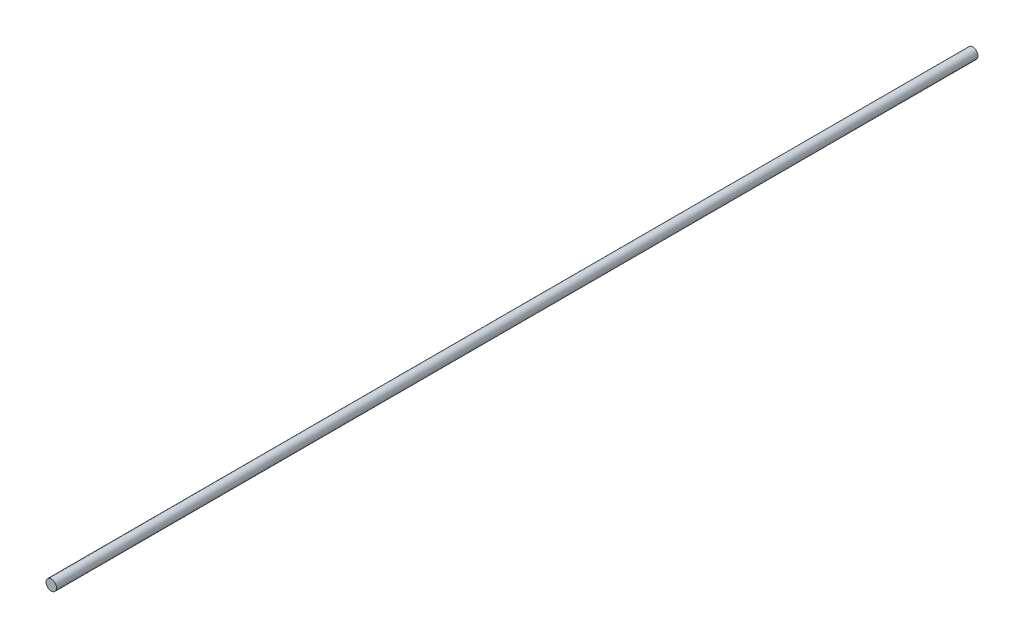
ISO-10303-21;
HEADER;
FILE_DESCRIPTION(('STEP AP214'),'2;1');
FILE_NAME('part.step','',(''),(''),'','','');
FILE_SCHEMA(('AUTOMOTIVE_DESIGN { 1 0 10303 214 1 1 1 1 }'));
ENDSEC;
DATA;
#1=APPLICATION_CONTEXT('core data for automotive mechanical design processes');
#2=APPLICATION_PROTOCOL_DEFINITION('international standard','automotive_design',2000,#1);
#3=PRODUCT_CONTEXT('',#1,'mechanical');
#4=PRODUCT('Part','Part','',(#3));
#5=PRODUCT_RELATED_PRODUCT_CATEGORY('part','',(#4));
#6=PRODUCT_DEFINITION_FORMATION('','',#4);
#7=PRODUCT_DEFINITION_CONTEXT('part definition',#1,'design');
#8=PRODUCT_DEFINITION('design','',#6,#7);
#9=PRODUCT_DEFINITION_SHAPE('','',#8);
#10=(LENGTH_UNIT() NAMED_UNIT(*) SI_UNIT(.MILLI.,.METRE.));
#11=(NAMED_UNIT(*) PLANE_ANGLE_UNIT() SI_UNIT($,.RADIAN.));
#12=(NAMED_UNIT(*) SI_UNIT($,.STERADIAN.) SOLID_ANGLE_UNIT());
#13=UNCERTAINTY_MEASURE_WITH_UNIT(LENGTH_MEASURE(1.E-05),#10,'distance_accuracy_value','');
#14=(GEOMETRIC_REPRESENTATION_CONTEXT(3) GLOBAL_UNCERTAINTY_ASSIGNED_CONTEXT((#13)) GLOBAL_UNIT_ASSIGNED_CONTEXT((#10,
#11,#12)) REPRESENTATION_CONTEXT('',''));
#15=CARTESIAN_POINT('',(0.,0.,0.));
#16=DIRECTION('',(0.,0.,1.));
#17=DIRECTION('',(1.,0.,0.));
#18=AXIS2_PLACEMENT_3D('',#15,#16,#17);
#19=CARTESIAN_POINT('',(0.,0.,220.));
#20=DIRECTION('',(0.,0.,-1.));
#21=DIRECTION('',(-1.,0.,0.));
#22=AXIS2_PLACEMENT_3D('',#19,#20,#21);
#23=CYLINDRICAL_SURFACE('',#22,2.5);
#24=CARTESIAN_POINT('',(0.,0.,220.));
#25=DIRECTION('',(0.,0.,1.));
#26=DIRECTION('',(1.,0.,0.));
#27=AXIS2_PLACEMENT_3D('',#24,#25,#26);
#28=CIRCLE('',#27,2.5);
#29=CARTESIAN_POINT('',(2.5,0.,220.));
#30=VERTEX_POINT('',#29);
#31=EDGE_CURVE('E10',#30,#30,#28,.T.);
#32=ORIENTED_EDGE('',*,*,#31,.F.);
#33=EDGE_LOOP('',(#32));
#34=FACE_BOUND('',#33,.T.);
#35=CARTESIAN_POINT('',(0.,0.,-220.));
#36=DIRECTION('',(0.,0.,1.));
#37=DIRECTION('',(1.,0.,0.));
#38=AXIS2_PLACEMENT_3D('',#35,#36,#37);
#39=CIRCLE('',#38,2.5);
#40=CARTESIAN_POINT('',(2.5,0.,-220.));
#41=VERTEX_POINT('',#40);
#42=EDGE_CURVE('E35',#41,#41,#39,.T.);
#43=ORIENTED_EDGE('',*,*,#42,.T.);
#44=EDGE_LOOP('',(#43));
#45=FACE_BOUND('',#44,.T.);
#46=ADVANCED_FACE('F32',(#34,#45),#23,.T.);
#47=CARTESIAN_POINT('',(0.,0.,220.));
#48=DIRECTION('',(0.,0.,1.));
#49=DIRECTION('',(1.,0.,0.));
#50=AXIS2_PLACEMENT_3D('',#47,#48,#49);
#51=PLANE('',#50);
#52=ORIENTED_EDGE('',*,*,#31,.T.);
#53=EDGE_LOOP('',(#52));
#54=FACE_BOUND('',#53,.T.);
#55=ADVANCED_FACE('F47',(#54),#51,.T.);
#56=CARTESIAN_POINT('',(0.,0.,-220.));
#57=DIRECTION('',(0.,0.,1.));
#58=DIRECTION('',(1.,0.,0.));
#59=AXIS2_PLACEMENT_3D('',#56,#57,#58);
#60=PLANE('',#59);
#61=ORIENTED_EDGE('',*,*,#42,.F.);
#62=EDGE_LOOP('',(#61));
#63=FACE_BOUND('',#62,.T.);
#64=ADVANCED_FACE('F45',(#63),#60,.F.);
#65=CLOSED_SHELL('',(#46,#55,#64));
#66=MANIFOLD_SOLID_BREP('B2',#65);
#67=ADVANCED_BREP_SHAPE_REPRESENTATION('',(#18,#66),#14);
#68=SHAPE_DEFINITION_REPRESENTATION(#9,#67);
ENDSEC;
END-ISO-10303-21;
